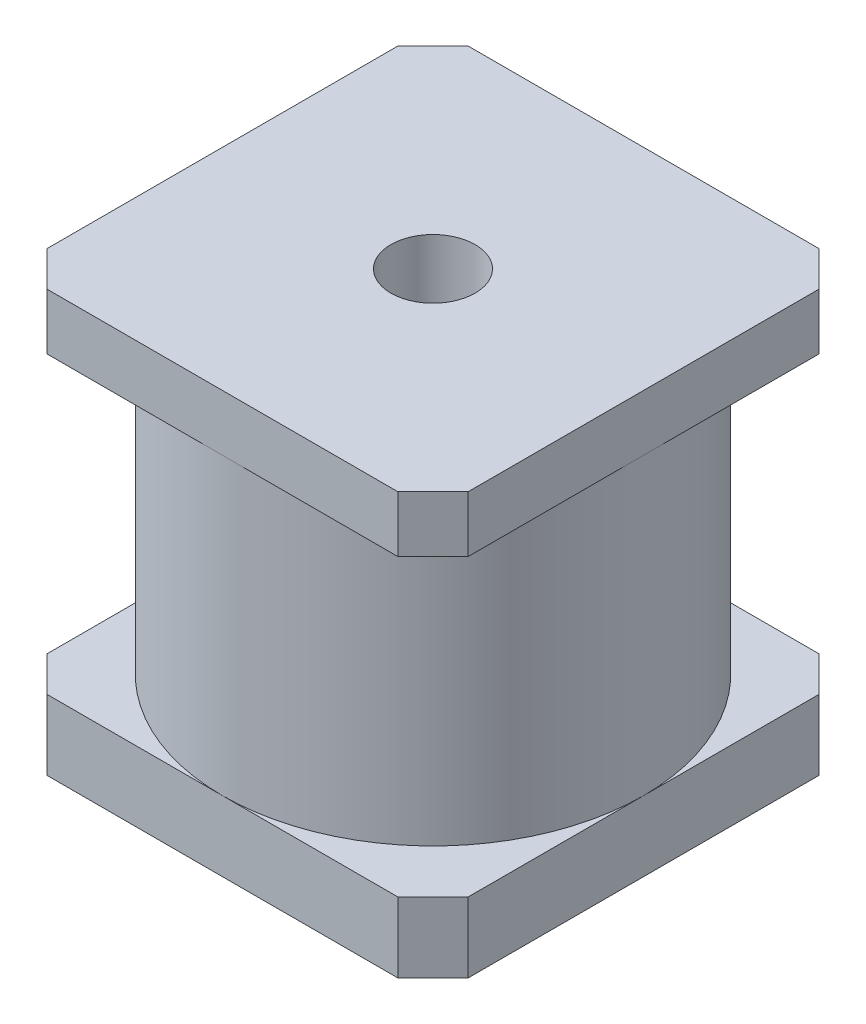
ISO-10303-21;
HEADER;
FILE_DESCRIPTION(('STEP AP214'),'2;1');
FILE_NAME('part.step','',(''),(''),'','','');
FILE_SCHEMA(('AUTOMOTIVE_DESIGN { 1 0 10303 214 1 1 1 1 }'));
ENDSEC;
DATA;
#1=APPLICATION_CONTEXT('core data for automotive mechanical design processes');
#2=APPLICATION_PROTOCOL_DEFINITION('international standard','automotive_design',2000,#1);
#3=PRODUCT_CONTEXT('',#1,'mechanical');
#4=PRODUCT('Part','Part','',(#3));
#5=PRODUCT_RELATED_PRODUCT_CATEGORY('part','',(#4));
#6=PRODUCT_DEFINITION_FORMATION('','',#4);
#7=PRODUCT_DEFINITION_CONTEXT('part definition',#1,'design');
#8=PRODUCT_DEFINITION('design','',#6,#7);
#9=PRODUCT_DEFINITION_SHAPE('','',#8);
#10=(LENGTH_UNIT() NAMED_UNIT(*) SI_UNIT(.MILLI.,.METRE.));
#11=(NAMED_UNIT(*) PLANE_ANGLE_UNIT() SI_UNIT($,.RADIAN.));
#12=(NAMED_UNIT(*) SI_UNIT($,.STERADIAN.) SOLID_ANGLE_UNIT());
#13=UNCERTAINTY_MEASURE_WITH_UNIT(LENGTH_MEASURE(1.E-05),#10,'distance_accuracy_value','');
#14=(GEOMETRIC_REPRESENTATION_CONTEXT(3) GLOBAL_UNCERTAINTY_ASSIGNED_CONTEXT((#13)) GLOBAL_UNIT_ASSIGNED_CONTEXT((#10,
#11,#12)) REPRESENTATION_CONTEXT('',''));
#15=CARTESIAN_POINT('',(0.,0.,0.));
#16=DIRECTION('',(0.,0.,1.));
#17=DIRECTION('',(1.,0.,0.));
#18=AXIS2_PLACEMENT_3D('',#15,#16,#17);
#19=CARTESIAN_POINT('',(0.,50.,0.));
#20=DIRECTION('',(0.,1.,0.));
#21=DIRECTION('',(1.,0.,0.));
#22=AXIS2_PLACEMENT_3D('',#19,#20,#21);
#23=PLANE('',#22);
#24=CARTESIAN_POINT('',(0.,50.,0.));
#25=DIRECTION('',(0.,1.,0.));
#26=DIRECTION('',(0.,0.,1.));
#27=AXIS2_PLACEMENT_3D('',#24,#25,#26);
#28=CIRCLE('',#27,6.);
#29=CARTESIAN_POINT('',(0.,50.,6.));
#30=VERTEX_POINT('',#29);
#31=EDGE_CURVE('E11',#30,#30,#28,.T.);
#32=ORIENTED_EDGE('',*,*,#31,.T.);
#33=EDGE_LOOP('',(#32));
#34=FACE_BOUND('',#33,.T.);
#35=ADVANCED_FACE('F17',(#34),#23,.T.);
#36=CARTESIAN_POINT('',(0.,50.,0.));
#37=DIRECTION('',(0.,1.,0.));
#38=DIRECTION('',(0.,0.,1.));
#39=AXIS2_PLACEMENT_3D('',#36,#37,#38);
#40=CYLINDRICAL_SURFACE('',#39,6.);
#41=ORIENTED_EDGE('',*,*,#31,.F.);
#42=EDGE_LOOP('',(#41));
#43=FACE_BOUND('',#42,.T.);
#44=CARTESIAN_POINT('',(0.,60.,0.));
#45=DIRECTION('',(0.,1.,0.));
#46=DIRECTION('',(0.,0.,1.));
#47=AXIS2_PLACEMENT_3D('',#44,#45,#46);
#48=CIRCLE('',#47,6.);
#49=CARTESIAN_POINT('',(0.,60.,6.));
#50=VERTEX_POINT('',#49);
#51=EDGE_CURVE('E360',#50,#50,#48,.T.);
#52=ORIENTED_EDGE('',*,*,#51,.T.);
#53=EDGE_LOOP('',(#52));
#54=FACE_BOUND('',#53,.T.);
#55=ADVANCED_FACE('F1212',(#43,#54),#40,.F.);
#56=CARTESIAN_POINT('',(30.,10.,25.));
#57=DIRECTION('',(-0.707106781186547,0.,-0.707106781186549));
#58=DIRECTION('',(-0.707106781186549,0.,0.707106781186547));
#59=AXIS2_PLACEMENT_3D('',#56,#57,#58);
#60=PLANE('',#59);
#61=DIRECTION('',(0.707106781186549,0.,-0.707106781186547));
#62=VECTOR('',#61,1.);
#63=CARTESIAN_POINT('',(30.,10.,25.));
#64=LINE('',#63,#62);
#65=CARTESIAN_POINT('',(25.,10.,30.));
#66=VERTEX_POINT('',#65);
#67=CARTESIAN_POINT('',(30.,10.,25.));
#68=VERTEX_POINT('',#67);
#69=EDGE_CURVE('E335',#66,#68,#64,.T.);
#70=ORIENTED_EDGE('',*,*,#69,.F.);
#71=DIRECTION('',(0.,1.,0.));
#72=VECTOR('',#71,1.);
#73=CARTESIAN_POINT('',(25.,10.,30.));
#74=LINE('',#73,#72);
#75=CARTESIAN_POINT('',(25.,0.,30.));
#76=VERTEX_POINT('',#75);
#77=EDGE_CURVE('E242',#76,#66,#74,.T.);
#78=ORIENTED_EDGE('',*,*,#77,.F.);
#79=DIRECTION('',(-0.707106781186549,0.,0.707106781186547));
#80=VECTOR('',#79,1.);
#81=CARTESIAN_POINT('',(30.,0.,25.));
#82=LINE('',#81,#80);
#83=CARTESIAN_POINT('',(30.,0.,25.));
#84=VERTEX_POINT('',#83);
#85=EDGE_CURVE('E169',#84,#76,#82,.T.);
#86=ORIENTED_EDGE('',*,*,#85,.F.);
#87=DIRECTION('',(0.,-1.,0.));
#88=VECTOR('',#87,1.);
#89=CARTESIAN_POINT('',(30.,10.,25.));
#90=LINE('',#89,#88);
#91=EDGE_CURVE('E178',#68,#84,#90,.T.);
#92=ORIENTED_EDGE('',*,*,#91,.F.);
#93=EDGE_LOOP('',(#70,#78,#86,#92));
#94=FACE_BOUND('',#93,.T.);
#95=ADVANCED_FACE('F425',(#94),#60,.F.);
#96=CARTESIAN_POINT('',(25.,10.,-30.));
#97=DIRECTION('',(-0.707106781186549,0.,0.707106781186547));
#98=DIRECTION('',(0.,1.,0.));
#99=AXIS2_PLACEMENT_3D('',#96,#97,#98);
#100=PLANE('',#99);
#101=DIRECTION('',(-0.707106781186547,0.,-0.707106781186549));
#102=VECTOR('',#101,1.);
#103=CARTESIAN_POINT('',(25.,10.,-30.));
#104=LINE('',#103,#102);
#105=CARTESIAN_POINT('',(30.,10.,-25.));
#106=VERTEX_POINT('',#105);
#107=CARTESIAN_POINT('',(25.,10.,-30.));
#108=VERTEX_POINT('',#107);
#109=EDGE_CURVE('E373',#106,#108,#104,.T.);
#110=ORIENTED_EDGE('',*,*,#109,.F.);
#111=DIRECTION('',(0.,1.,0.));
#112=VECTOR('',#111,1.);
#113=CARTESIAN_POINT('',(30.,10.,-25.));
#114=LINE('',#113,#112);
#115=CARTESIAN_POINT('',(30.,0.,-25.));
#116=VERTEX_POINT('',#115);
#117=EDGE_CURVE('E174',#116,#106,#114,.T.);
#118=ORIENTED_EDGE('',*,*,#117,.F.);
#119=DIRECTION('',(0.707106781186547,0.,0.707106781186549));
#120=VECTOR('',#119,1.);
#121=CARTESIAN_POINT('',(25.,0.,-30.));
#122=LINE('',#121,#120);
#123=CARTESIAN_POINT('',(25.,0.,-30.));
#124=VERTEX_POINT('',#123);
#125=EDGE_CURVE('E192',#124,#116,#122,.T.);
#126=ORIENTED_EDGE('',*,*,#125,.F.);
#127=DIRECTION('',(0.,-1.,0.));
#128=VECTOR('',#127,1.);
#129=CARTESIAN_POINT('',(25.,10.,-30.));
#130=LINE('',#129,#128);
#131=EDGE_CURVE('E179',#108,#124,#130,.T.);
#132=ORIENTED_EDGE('',*,*,#131,.F.);
#133=EDGE_LOOP('',(#110,#118,#126,#132));
#134=FACE_BOUND('',#133,.T.);
#135=ADVANCED_FACE('F449',(#134),#100,.F.);
#136=CARTESIAN_POINT('',(-30.,10.,-25.));
#137=DIRECTION('',(0.707106781186547,0.,0.707106781186549));
#138=DIRECTION('',(0.,-1.,0.));
#139=AXIS2_PLACEMENT_3D('',#136,#137,#138);
#140=PLANE('',#139);
#141=DIRECTION('',(-0.707106781186549,0.,0.707106781186547));
#142=VECTOR('',#141,1.);
#143=CARTESIAN_POINT('',(-30.,10.,-25.));
#144=LINE('',#143,#142);
#145=CARTESIAN_POINT('',(-25.,10.,-30.));
#146=VERTEX_POINT('',#145);
#147=CARTESIAN_POINT('',(-30.,10.,-25.));
#148=VERTEX_POINT('',#147);
#149=EDGE_CURVE('E183',#146,#148,#144,.T.);
#150=ORIENTED_EDGE('',*,*,#149,.F.);
#151=DIRECTION('',(0.,1.,0.));
#152=VECTOR('',#151,1.);
#153=CARTESIAN_POINT('',(-25.,10.,-30.));
#154=LINE('',#153,#152);
#155=CARTESIAN_POINT('',(-25.,0.,-30.));
#156=VERTEX_POINT('',#155);
#157=EDGE_CURVE('E250',#156,#146,#154,.T.);
#158=ORIENTED_EDGE('',*,*,#157,.F.);
#159=DIRECTION('',(0.707106781186549,0.,-0.707106781186547));
#160=VECTOR('',#159,1.);
#161=CARTESIAN_POINT('',(-30.,0.,-25.));
#162=LINE('',#161,#160);
#163=CARTESIAN_POINT('',(-30.,0.,-25.));
#164=VERTEX_POINT('',#163);
#165=EDGE_CURVE('E190',#164,#156,#162,.T.);
#166=ORIENTED_EDGE('',*,*,#165,.F.);
#167=DIRECTION('',(0.,-1.,0.));
#168=VECTOR('',#167,1.);
#169=CARTESIAN_POINT('',(-30.,10.,-25.));
#170=LINE('',#169,#168);
#171=EDGE_CURVE('E399',#148,#164,#170,.T.);
#172=ORIENTED_EDGE('',*,*,#171,.F.);
#173=EDGE_LOOP('',(#150,#158,#166,#172));
#174=FACE_BOUND('',#173,.T.);
#175=ADVANCED_FACE('F439',(#174),#140,.F.);
#176=CARTESIAN_POINT('',(-25.,10.,30.));
#177=DIRECTION('',(0.707106781186549,0.,-0.707106781186547));
#178=DIRECTION('',(0.,-1.,0.));
#179=AXIS2_PLACEMENT_3D('',#176,#177,#178);
#180=PLANE('',#179);
#181=DIRECTION('',(0.707106781186547,0.,0.707106781186549));
#182=VECTOR('',#181,1.);
#183=CARTESIAN_POINT('',(-25.,10.,30.));
#184=LINE('',#183,#182);
#185=CARTESIAN_POINT('',(-30.,10.,25.));
#186=VERTEX_POINT('',#185);
#187=CARTESIAN_POINT('',(-25.,10.,30.));
#188=VERTEX_POINT('',#187);
#189=EDGE_CURVE('E275',#186,#188,#184,.T.);
#190=ORIENTED_EDGE('',*,*,#189,.F.);
#191=DIRECTION('',(0.,1.,0.));
#192=VECTOR('',#191,1.);
#193=CARTESIAN_POINT('',(-30.,10.,25.));
#194=LINE('',#193,#192);
#195=CARTESIAN_POINT('',(-30.,0.,25.));
#196=VERTEX_POINT('',#195);
#197=EDGE_CURVE('E211',#196,#186,#194,.T.);
#198=ORIENTED_EDGE('',*,*,#197,.F.);
#199=DIRECTION('',(-0.707106781186547,0.,-0.707106781186549));
#200=VECTOR('',#199,1.);
#201=CARTESIAN_POINT('',(-25.,0.,30.));
#202=LINE('',#201,#200);
#203=CARTESIAN_POINT('',(-25.,0.,30.));
#204=VERTEX_POINT('',#203);
#205=EDGE_CURVE('E187',#204,#196,#202,.T.);
#206=ORIENTED_EDGE('',*,*,#205,.F.);
#207=DIRECTION('',(0.,-1.,0.));
#208=VECTOR('',#207,1.);
#209=CARTESIAN_POINT('',(-25.,10.,30.));
#210=LINE('',#209,#208);
#211=EDGE_CURVE('E243',#188,#204,#210,.T.);
#212=ORIENTED_EDGE('',*,*,#211,.F.);
#213=EDGE_LOOP('',(#190,#198,#206,#212));
#214=FACE_BOUND('',#213,.T.);
#215=ADVANCED_FACE('F432',(#214),#180,.F.);
#216=CARTESIAN_POINT('',(25.,52.,30.));
#217=DIRECTION('',(-0.707106781186549,0.,-0.707106781186547));
#218=DIRECTION('',(-0.707106781186547,0.,0.707106781186549));
#219=AXIS2_PLACEMENT_3D('',#216,#217,#218);
#220=PLANE('',#219);
#221=DIRECTION('',(-0.707106781186547,0.,0.707106781186549));
#222=VECTOR('',#221,1.);
#223=CARTESIAN_POINT('',(25.,52.,30.));
#224=LINE('',#223,#222);
#225=CARTESIAN_POINT('',(30.,52.,25.));
#226=VERTEX_POINT('',#225);
#227=CARTESIAN_POINT('',(25.,52.,30.));
#228=VERTEX_POINT('',#227);
#229=EDGE_CURVE('E260',#226,#228,#224,.T.);
#230=ORIENTED_EDGE('',*,*,#229,.F.);
#231=DIRECTION('',(0.,-1.,0.));
#232=VECTOR('',#231,1.);
#233=CARTESIAN_POINT('',(30.,52.,25.));
#234=LINE('',#233,#232);
#235=CARTESIAN_POINT('',(30.,60.,25.));
#236=VERTEX_POINT('',#235);
#237=EDGE_CURVE('E339',#236,#226,#234,.T.);
#238=ORIENTED_EDGE('',*,*,#237,.F.);
#239=DIRECTION('',(0.707106781186547,0.,-0.707106781186549));
#240=VECTOR('',#239,1.);
#241=CARTESIAN_POINT('',(27.5,60.,27.5));
#242=LINE('',#241,#240);
#243=CARTESIAN_POINT('',(25.,60.,30.));
#244=VERTEX_POINT('',#243);
#245=EDGE_CURVE('E232',#244,#236,#242,.T.);
#246=ORIENTED_EDGE('',*,*,#245,.F.);
#247=DIRECTION('',(0.,1.,0.));
#248=VECTOR('',#247,1.);
#249=CARTESIAN_POINT('',(25.,52.,30.));
#250=LINE('',#249,#248);
#251=EDGE_CURVE('E284',#228,#244,#250,.T.);
#252=ORIENTED_EDGE('',*,*,#251,.F.);
#253=EDGE_LOOP('',(#230,#238,#246,#252));
#254=FACE_BOUND('',#253,.T.);
#255=ADVANCED_FACE('F556',(#254),#220,.F.);
#256=CARTESIAN_POINT('',(30.,52.,-25.));
#257=DIRECTION('',(-0.707106781186547,0.,0.707106781186549));
#258=DIRECTION('',(0.,1.,0.));
#259=AXIS2_PLACEMENT_3D('',#256,#257,#258);
#260=PLANE('',#259);
#261=DIRECTION('',(0.707106781186549,0.,0.707106781186547));
#262=VECTOR('',#261,1.);
#263=CARTESIAN_POINT('',(30.,52.,-25.));
#264=LINE('',#263,#262);
#265=CARTESIAN_POINT('',(25.,52.,-30.));
#266=VERTEX_POINT('',#265);
#267=CARTESIAN_POINT('',(30.,52.,-25.));
#268=VERTEX_POINT('',#267);
#269=EDGE_CURVE('E261',#266,#268,#264,.T.);
#270=ORIENTED_EDGE('',*,*,#269,.F.);
#271=DIRECTION('',(0.,-1.,0.));
#272=VECTOR('',#271,1.);
#273=CARTESIAN_POINT('',(25.,52.,-30.));
#274=LINE('',#273,#272);
#275=CARTESIAN_POINT('',(25.,60.,-30.));
#276=VERTEX_POINT('',#275);
#277=EDGE_CURVE('E322',#276,#266,#274,.T.);
#278=ORIENTED_EDGE('',*,*,#277,.F.);
#279=DIRECTION('',(-0.707106781186549,0.,-0.707106781186547));
#280=VECTOR('',#279,1.);
#281=CARTESIAN_POINT('',(27.5,60.,-27.5));
#282=LINE('',#281,#280);
#283=CARTESIAN_POINT('',(30.,60.,-25.));
#284=VERTEX_POINT('',#283);
#285=EDGE_CURVE('E228',#284,#276,#282,.T.);
#286=ORIENTED_EDGE('',*,*,#285,.F.);
#287=DIRECTION('',(0.,1.,0.));
#288=VECTOR('',#287,1.);
#289=CARTESIAN_POINT('',(30.,52.,-25.));
#290=LINE('',#289,#288);
#291=EDGE_CURVE('E326',#268,#284,#290,.T.);
#292=ORIENTED_EDGE('',*,*,#291,.F.);
#293=EDGE_LOOP('',(#270,#278,#286,#292));
#294=FACE_BOUND('',#293,.T.);
#295=ADVANCED_FACE('F559',(#294),#260,.F.);
#296=CARTESIAN_POINT('',(-25.,52.,-30.));
#297=DIRECTION('',(0.707106781186549,0.,0.707106781186547));
#298=DIRECTION('',(0.,-1.,0.));
#299=AXIS2_PLACEMENT_3D('',#296,#297,#298);
#300=PLANE('',#299);
#301=DIRECTION('',(0.707106781186547,0.,-0.707106781186549));
#302=VECTOR('',#301,1.);
#303=CARTESIAN_POINT('',(-25.,52.,-30.));
#304=LINE('',#303,#302);
#305=CARTESIAN_POINT('',(-30.,52.,-25.));
#306=VERTEX_POINT('',#305);
#307=CARTESIAN_POINT('',(-25.,52.,-30.));
#308=VERTEX_POINT('',#307);
#309=EDGE_CURVE('E216',#306,#308,#304,.T.);
#310=ORIENTED_EDGE('',*,*,#309,.F.);
#311=DIRECTION('',(0.,-1.,0.));
#312=VECTOR('',#311,1.);
#313=CARTESIAN_POINT('',(-30.,52.,-25.));
#314=LINE('',#313,#312);
#315=CARTESIAN_POINT('',(-30.,60.,-25.));
#316=VERTEX_POINT('',#315);
#317=EDGE_CURVE('E310',#316,#306,#314,.T.);
#318=ORIENTED_EDGE('',*,*,#317,.F.);
#319=DIRECTION('',(-0.707106781186547,0.,0.707106781186549));
#320=VECTOR('',#319,1.);
#321=CARTESIAN_POINT('',(-27.5,60.,-27.5));
#322=LINE('',#321,#320);
#323=CARTESIAN_POINT('',(-25.,60.,-30.));
#324=VERTEX_POINT('',#323);
#325=EDGE_CURVE('E231',#324,#316,#322,.T.);
#326=ORIENTED_EDGE('',*,*,#325,.F.);
#327=DIRECTION('',(0.,1.,0.));
#328=VECTOR('',#327,1.);
#329=CARTESIAN_POINT('',(-25.,52.,-30.));
#330=LINE('',#329,#328);
#331=EDGE_CURVE('E314',#308,#324,#330,.T.);
#332=ORIENTED_EDGE('',*,*,#331,.F.);
#333=EDGE_LOOP('',(#310,#318,#326,#332));
#334=FACE_BOUND('',#333,.T.);
#335=ADVANCED_FACE('F537',(#334),#300,.F.);
#336=CARTESIAN_POINT('',(-30.,52.,25.));
#337=DIRECTION('',(0.707106781186547,0.,-0.707106781186549));
#338=DIRECTION('',(0.,-1.,0.));
#339=AXIS2_PLACEMENT_3D('',#336,#337,#338);
#340=PLANE('',#339);
#341=DIRECTION('',(-0.707106781186549,0.,-0.707106781186547));
#342=VECTOR('',#341,1.);
#343=CARTESIAN_POINT('',(-30.,52.,25.));
#344=LINE('',#343,#342);
#345=CARTESIAN_POINT('',(-25.,52.,30.));
#346=VERTEX_POINT('',#345);
#347=CARTESIAN_POINT('',(-30.,52.,25.));
#348=VERTEX_POINT('',#347);
#349=EDGE_CURVE('E288',#346,#348,#344,.T.);
#350=ORIENTED_EDGE('',*,*,#349,.F.);
#351=DIRECTION('',(0.,-1.,0.));
#352=VECTOR('',#351,1.);
#353=CARTESIAN_POINT('',(-25.,52.,30.));
#354=LINE('',#353,#352);
#355=CARTESIAN_POINT('',(-25.,60.,30.));
#356=VERTEX_POINT('',#355);
#357=EDGE_CURVE('E347',#356,#346,#354,.T.);
#358=ORIENTED_EDGE('',*,*,#357,.F.);
#359=DIRECTION('',(0.707106781186549,0.,0.707106781186547));
#360=VECTOR('',#359,1.);
#361=CARTESIAN_POINT('',(-27.5,60.,27.5));
#362=LINE('',#361,#360);
#363=CARTESIAN_POINT('',(-30.,60.,25.));
#364=VERTEX_POINT('',#363);
#365=EDGE_CURVE('E313',#364,#356,#362,.T.);
#366=ORIENTED_EDGE('',*,*,#365,.F.);
#367=DIRECTION('',(0.,1.,0.));
#368=VECTOR('',#367,1.);
#369=CARTESIAN_POINT('',(-30.,52.,25.));
#370=LINE('',#369,#368);
#371=EDGE_CURVE('E302',#348,#364,#370,.T.);
#372=ORIENTED_EDGE('',*,*,#371,.F.);
#373=EDGE_LOOP('',(#350,#358,#366,#372));
#374=FACE_BOUND('',#373,.T.);
#375=ADVANCED_FACE('F545',(#374),#340,.F.);
#376=CARTESIAN_POINT('',(0.,15.,0.));
#377=DIRECTION('',(0.,-1.,0.));
#378=DIRECTION('',(0.,0.,-1.));
#379=AXIS2_PLACEMENT_3D('',#376,#377,#378);
#380=PLANE('',#379);
#381=CARTESIAN_POINT('',(0.,15.,0.));
#382=DIRECTION('',(0.,-1.,0.));
#383=DIRECTION('',(0.,0.,-1.));
#384=AXIS2_PLACEMENT_3D('',#381,#382,#383);
#385=CIRCLE('',#384,7.);
#386=CARTESIAN_POINT('',(0.,15.,-7.));
#387=VERTEX_POINT('',#386);
#388=EDGE_CURVE('E27',#387,#387,#385,.T.);
#389=ORIENTED_EDGE('',*,*,#388,.T.);
#390=EDGE_LOOP('',(#389));
#391=FACE_BOUND('',#390,.T.);
#392=ADVANCED_FACE('F1128',(#391),#380,.T.);
#393=CARTESIAN_POINT('',(0.,-5.000012,0.));
#394=DIRECTION('',(0.,1.,0.));
#395=DIRECTION('',(0.,0.,1.));
#396=AXIS2_PLACEMENT_3D('',#393,#394,#395);
#397=CYLINDRICAL_SURFACE('',#396,7.);
#398=CARTESIAN_POINT('',(0.,-5.,0.));
#399=DIRECTION('',(0.,1.,0.));
#400=DIRECTION('',(0.,0.,-1.));
#401=AXIS2_PLACEMENT_3D('',#398,#399,#400);
#402=CIRCLE('',#401,7.);
#403=CARTESIAN_POINT('',(0.,-5.,-7.));
#404=VERTEX_POINT('',#403);
#405=EDGE_CURVE('E20',#404,#404,#402,.T.);
#406=ORIENTED_EDGE('',*,*,#405,.F.);
#407=EDGE_LOOP('',(#406));
#408=FACE_BOUND('',#407,.T.);
#409=ORIENTED_EDGE('',*,*,#388,.F.);
#410=EDGE_LOOP('',(#409));
#411=FACE_BOUND('',#410,.T.);
#412=ADVANCED_FACE('F1117',(#408,#411),#397,.F.);
#413=CARTESIAN_POINT('',(0.,-5.,0.));
#414=DIRECTION('',(0.,-1.,0.));
#415=DIRECTION('',(0.,0.,-1.));
#416=AXIS2_PLACEMENT_3D('',#413,#414,#415);
#417=PLANE('',#416);
#418=ORIENTED_EDGE('',*,*,#405,.T.);
#419=EDGE_LOOP('',(#418));
#420=FACE_BOUND('',#419,.T.);
#421=CARTESIAN_POINT('',(0.,-5.,0.));
#422=DIRECTION('',(0.,-1.,0.));
#423=DIRECTION('',(0.,0.,-1.));
#424=AXIS2_PLACEMENT_3D('',#421,#422,#423);
#425=CIRCLE('',#424,17.5);
#426=CARTESIAN_POINT('',(0.,-5.,-17.5));
#427=VERTEX_POINT('',#426);
#428=EDGE_CURVE('E158',#427,#427,#425,.T.);
#429=ORIENTED_EDGE('',*,*,#428,.T.);
#430=EDGE_LOOP('',(#429));
#431=FACE_BOUND('',#430,.T.);
#432=ADVANCED_FACE('F159',(#420,#431),#417,.T.);
#433=CARTESIAN_POINT('',(0.,-5.,0.));
#434=DIRECTION('',(0.,1.,0.));
#435=DIRECTION('',(0.,0.,1.));
#436=AXIS2_PLACEMENT_3D('',#433,#434,#435);
#437=CYLINDRICAL_SURFACE('',#436,17.5);
#438=ORIENTED_EDGE('',*,*,#428,.F.);
#439=EDGE_LOOP('',(#438));
#440=FACE_BOUND('',#439,.T.);
#441=CARTESIAN_POINT('',(0.,0.,0.));
#442=DIRECTION('',(0.,-1.,0.));
#443=DIRECTION('',(0.,0.,-1.));
#444=AXIS2_PLACEMENT_3D('',#441,#442,#443);
#445=CIRCLE('',#444,17.5);
#446=CARTESIAN_POINT('',(0.,0.,-17.5));
#447=VERTEX_POINT('',#446);
#448=EDGE_CURVE('E162',#447,#447,#445,.T.);
#449=ORIENTED_EDGE('',*,*,#448,.T.);
#450=EDGE_LOOP('',(#449));
#451=FACE_BOUND('',#450,.T.);
#452=ADVANCED_FACE('F1097',(#440,#451),#437,.T.);
#453=CARTESIAN_POINT('',(0.,0.,0.));
#454=DIRECTION('',(0.,1.,0.));
#455=DIRECTION('',(1.,0.,0.));
#456=AXIS2_PLACEMENT_3D('',#453,#454,#455);
#457=PLANE('',#456);
#458=ORIENTED_EDGE('',*,*,#448,.F.);
#459=EDGE_LOOP('',(#458));
#460=FACE_BOUND('',#459,.T.);
#461=DIRECTION('',(-1.,0.,0.));
#462=VECTOR('',#461,1.);
#463=CARTESIAN_POINT('',(30.,0.,30.));
#464=LINE('',#463,#462);
#465=EDGE_CURVE('E238',#76,#204,#464,.T.);
#466=ORIENTED_EDGE('',*,*,#465,.T.);
#467=ORIENTED_EDGE('',*,*,#205,.T.);
#468=DIRECTION('',(0.,0.,-1.));
#469=VECTOR('',#468,1.);
#470=CARTESIAN_POINT('',(-30.,0.,-30.));
#471=LINE('',#470,#469);
#472=EDGE_CURVE('E215',#196,#164,#471,.T.);
#473=ORIENTED_EDGE('',*,*,#472,.T.);
#474=ORIENTED_EDGE('',*,*,#165,.T.);
#475=DIRECTION('',(1.,0.,0.));
#476=VECTOR('',#475,1.);
#477=CARTESIAN_POINT('',(30.,0.,-30.));
#478=LINE('',#477,#476);
#479=EDGE_CURVE('E369',#156,#124,#478,.T.);
#480=ORIENTED_EDGE('',*,*,#479,.T.);
#481=ORIENTED_EDGE('',*,*,#125,.T.);
#482=DIRECTION('',(0.,0.,1.));
#483=VECTOR('',#482,1.);
#484=CARTESIAN_POINT('',(30.,0.,-30.));
#485=LINE('',#484,#483);
#486=EDGE_CURVE('E172',#116,#84,#485,.T.);
#487=ORIENTED_EDGE('',*,*,#486,.T.);
#488=ORIENTED_EDGE('',*,*,#85,.T.);
#489=EDGE_LOOP('',(#466,#467,#473,#474,#480,#481,#487,#488));
#490=FACE_BOUND('',#489,.T.);
#491=ADVANCED_FACE('F419',(#460,#490),#457,.F.);
#492=CARTESIAN_POINT('',(0.,10.,0.));
#493=DIRECTION('',(0.,-1.,0.));
#494=DIRECTION('',(0.,0.,-1.));
#495=AXIS2_PLACEMENT_3D('',#492,#493,#494);
#496=PLANE('',#495);
#497=DIRECTION('',(1.,0.,0.));
#498=VECTOR('',#497,1.);
#499=CARTESIAN_POINT('',(30.,10.,-30.));
#500=LINE('',#499,#498);
#501=CARTESIAN_POINT('',(0.,10.,-30.));
#502=VERTEX_POINT('',#501);
#503=EDGE_CURVE('E184',#146,#502,#500,.T.);
#504=ORIENTED_EDGE('',*,*,#503,.F.);
#505=ORIENTED_EDGE('',*,*,#149,.T.);
#506=DIRECTION('',(0.,0.,-1.));
#507=VECTOR('',#506,1.);
#508=CARTESIAN_POINT('',(-30.,10.,-30.));
#509=LINE('',#508,#507);
#510=CARTESIAN_POINT('',(-30.,10.,0.));
#511=VERTEX_POINT('',#510);
#512=EDGE_CURVE('E214',#511,#148,#509,.T.);
#513=ORIENTED_EDGE('',*,*,#512,.F.);
#514=CARTESIAN_POINT('',(0.,10.,0.));
#515=DIRECTION('',(0.,-1.,0.));
#516=DIRECTION('',(0.,0.,-1.));
#517=AXIS2_PLACEMENT_3D('',#514,#515,#516);
#518=CIRCLE('',#517,30.);
#519=EDGE_CURVE('E574',#511,#502,#518,.T.);
#520=ORIENTED_EDGE('',*,*,#519,.T.);
#521=EDGE_LOOP('',(#504,#505,#513,#520));
#522=FACE_BOUND('',#521,.T.);
#523=ADVANCED_FACE('F1078',(#522),#496,.F.);
#524=CARTESIAN_POINT('',(30.,10.,-30.));
#525=DIRECTION('',(0.,0.,-1.));
#526=DIRECTION('',(0.,-1.,0.));
#527=AXIS2_PLACEMENT_3D('',#524,#525,#526);
#528=PLANE('',#527);
#529=ORIENTED_EDGE('',*,*,#479,.F.);
#530=ORIENTED_EDGE('',*,*,#157,.T.);
#531=ORIENTED_EDGE('',*,*,#503,.T.);
#532=DIRECTION('',(1.,0.,0.));
#533=VECTOR('',#532,1.);
#534=CARTESIAN_POINT('',(30.,10.,-30.));
#535=LINE('',#534,#533);
#536=EDGE_CURVE('E377',#502,#108,#535,.T.);
#537=ORIENTED_EDGE('',*,*,#536,.T.);
#538=ORIENTED_EDGE('',*,*,#131,.T.);
#539=EDGE_LOOP('',(#529,#530,#531,#537,#538));
#540=FACE_BOUND('',#539,.T.);
#541=ADVANCED_FACE('F446',(#540),#528,.T.);
#542=CARTESIAN_POINT('',(30.,10.,-30.));
#543=DIRECTION('',(1.,0.,0.));
#544=DIRECTION('',(0.,1.,0.));
#545=AXIS2_PLACEMENT_3D('',#542,#543,#544);
#546=PLANE('',#545);
#547=ORIENTED_EDGE('',*,*,#486,.F.);
#548=ORIENTED_EDGE('',*,*,#117,.T.);
#549=DIRECTION('',(0.,0.,1.));
#550=VECTOR('',#549,1.);
#551=CARTESIAN_POINT('',(30.,10.,-30.));
#552=LINE('',#551,#550);
#553=CARTESIAN_POINT('',(30.,10.,0.));
#554=VERTEX_POINT('',#553);
#555=EDGE_CURVE('E365',#106,#554,#552,.T.);
#556=ORIENTED_EDGE('',*,*,#555,.T.);
#557=DIRECTION('',(0.,0.,1.));
#558=VECTOR('',#557,1.);
#559=CARTESIAN_POINT('',(30.,10.,-30.));
#560=LINE('',#559,#558);
#561=EDGE_CURVE('E331',#554,#68,#560,.T.);
#562=ORIENTED_EDGE('',*,*,#561,.T.);
#563=ORIENTED_EDGE('',*,*,#91,.T.);
#564=EDGE_LOOP('',(#547,#548,#556,#562,#563));
#565=FACE_BOUND('',#564,.T.);
#566=ADVANCED_FACE('F421',(#565),#546,.T.);
#567=CARTESIAN_POINT('',(30.,10.,30.));
#568=DIRECTION('',(0.,0.,1.));
#569=DIRECTION('',(1.,0.,0.));
#570=AXIS2_PLACEMENT_3D('',#567,#568,#569);
#571=PLANE('',#570);
#572=DIRECTION('',(-1.,0.,0.));
#573=VECTOR('',#572,1.);
#574=CARTESIAN_POINT('',(30.,10.,30.));
#575=LINE('',#574,#573);
#576=CARTESIAN_POINT('',(0.,10.,30.));
#577=VERTEX_POINT('',#576);
#578=EDGE_CURVE('E279',#577,#188,#575,.T.);
#579=ORIENTED_EDGE('',*,*,#578,.T.);
#580=ORIENTED_EDGE('',*,*,#211,.T.);
#581=ORIENTED_EDGE('',*,*,#465,.F.);
#582=ORIENTED_EDGE('',*,*,#77,.T.);
#583=DIRECTION('',(-1.,0.,0.));
#584=VECTOR('',#583,1.);
#585=CARTESIAN_POINT('',(30.,10.,30.));
#586=LINE('',#585,#584);
#587=EDGE_CURVE('E381',#66,#577,#586,.T.);
#588=ORIENTED_EDGE('',*,*,#587,.T.);
#589=EDGE_LOOP('',(#579,#580,#581,#582,#588));
#590=FACE_BOUND('',#589,.T.);
#591=ADVANCED_FACE('F427',(#590),#571,.T.);
#592=CARTESIAN_POINT('',(-30.,10.,-30.));
#593=DIRECTION('',(-1.,0.,0.));
#594=DIRECTION('',(0.,0.,1.));
#595=AXIS2_PLACEMENT_3D('',#592,#593,#594);
#596=PLANE('',#595);
#597=ORIENTED_EDGE('',*,*,#472,.F.);
#598=ORIENTED_EDGE('',*,*,#197,.T.);
#599=DIRECTION('',(0.,0.,-1.));
#600=VECTOR('',#599,1.);
#601=CARTESIAN_POINT('',(-30.,10.,-30.));
#602=LINE('',#601,#600);
#603=EDGE_CURVE('E280',#186,#511,#602,.T.);
#604=ORIENTED_EDGE('',*,*,#603,.T.);
#605=ORIENTED_EDGE('',*,*,#512,.T.);
#606=ORIENTED_EDGE('',*,*,#171,.T.);
#607=EDGE_LOOP('',(#597,#598,#604,#605,#606));
#608=FACE_BOUND('',#607,.T.);
#609=ADVANCED_FACE('F435',(#608),#596,.T.);
#610=CARTESIAN_POINT('',(0.,10.,0.));
#611=DIRECTION('',(0.,-1.,0.));
#612=DIRECTION('',(0.,0.,-1.));
#613=AXIS2_PLACEMENT_3D('',#610,#611,#612);
#614=PLANE('',#613);
#615=ORIENTED_EDGE('',*,*,#603,.F.);
#616=ORIENTED_EDGE('',*,*,#189,.T.);
#617=ORIENTED_EDGE('',*,*,#578,.F.);
#618=CARTESIAN_POINT('',(0.,10.,0.));
#619=DIRECTION('',(0.,-1.,0.));
#620=DIRECTION('',(0.,0.,-1.));
#621=AXIS2_PLACEMENT_3D('',#618,#619,#620);
#622=CIRCLE('',#621,30.);
#623=EDGE_CURVE('E209',#577,#511,#622,.T.);
#624=ORIENTED_EDGE('',*,*,#623,.T.);
#625=EDGE_LOOP('',(#615,#616,#617,#624));
#626=FACE_BOUND('',#625,.T.);
#627=ADVANCED_FACE('F930',(#626),#614,.F.);
#628=CARTESIAN_POINT('',(0.,10.,0.));
#629=DIRECTION('',(0.,-1.,0.));
#630=DIRECTION('',(0.,0.,-1.));
#631=AXIS2_PLACEMENT_3D('',#628,#629,#630);
#632=PLANE('',#631);
#633=ORIENTED_EDGE('',*,*,#587,.F.);
#634=ORIENTED_EDGE('',*,*,#69,.T.);
#635=ORIENTED_EDGE('',*,*,#561,.F.);
#636=CARTESIAN_POINT('',(0.,10.,0.));
#637=DIRECTION('',(0.,-1.,0.));
#638=DIRECTION('',(0.,0.,-1.));
#639=AXIS2_PLACEMENT_3D('',#636,#637,#638);
#640=CIRCLE('',#639,30.);
#641=EDGE_CURVE('E233',#554,#577,#640,.T.);
#642=ORIENTED_EDGE('',*,*,#641,.T.);
#643=EDGE_LOOP('',(#633,#634,#635,#642));
#644=FACE_BOUND('',#643,.T.);
#645=ADVANCED_FACE('F471',(#644),#632,.F.);
#646=CARTESIAN_POINT('',(0.,10.,0.));
#647=DIRECTION('',(0.,-1.,0.));
#648=DIRECTION('',(0.,0.,-1.));
#649=AXIS2_PLACEMENT_3D('',#646,#647,#648);
#650=PLANE('',#649);
#651=ORIENTED_EDGE('',*,*,#555,.F.);
#652=ORIENTED_EDGE('',*,*,#109,.T.);
#653=ORIENTED_EDGE('',*,*,#536,.F.);
#654=CARTESIAN_POINT('',(0.,10.,0.));
#655=DIRECTION('',(0.,-1.,0.));
#656=DIRECTION('',(0.,0.,-1.));
#657=AXIS2_PLACEMENT_3D('',#654,#655,#656);
#658=CIRCLE('',#657,30.);
#659=EDGE_CURVE('E458',#502,#554,#658,.T.);
#660=ORIENTED_EDGE('',*,*,#659,.T.);
#661=EDGE_LOOP('',(#651,#652,#653,#660));
#662=FACE_BOUND('',#661,.T.);
#663=ADVANCED_FACE('F455',(#662),#650,.F.);
#664=CARTESIAN_POINT('',(0.,60.,0.));
#665=DIRECTION('',(0.,1.,0.));
#666=DIRECTION('',(1.,0.,0.));
#667=AXIS2_PLACEMENT_3D('',#664,#665,#666);
#668=PLANE('',#667);
#669=ORIENTED_EDGE('',*,*,#51,.F.);
#670=EDGE_LOOP('',(#669));
#671=FACE_BOUND('',#670,.T.);
#672=DIRECTION('',(0.,0.,1.));
#673=VECTOR('',#672,1.);
#674=CARTESIAN_POINT('',(-30.,60.,30.));
#675=LINE('',#674,#673);
#676=EDGE_CURVE('E306',#316,#364,#675,.T.);
#677=ORIENTED_EDGE('',*,*,#676,.T.);
#678=ORIENTED_EDGE('',*,*,#365,.T.);
#679=DIRECTION('',(1.,0.,0.));
#680=VECTOR('',#679,1.);
#681=CARTESIAN_POINT('',(30.,60.,30.));
#682=LINE('',#681,#680);
#683=EDGE_CURVE('E343',#356,#244,#682,.T.);
#684=ORIENTED_EDGE('',*,*,#683,.T.);
#685=ORIENTED_EDGE('',*,*,#245,.T.);
#686=DIRECTION('',(0.,0.,-1.));
#687=VECTOR('',#686,1.);
#688=CARTESIAN_POINT('',(30.,60.,30.));
#689=LINE('',#688,#687);
#690=EDGE_CURVE('E330',#236,#284,#689,.T.);
#691=ORIENTED_EDGE('',*,*,#690,.T.);
#692=ORIENTED_EDGE('',*,*,#285,.T.);
#693=DIRECTION('',(-1.,0.,0.));
#694=VECTOR('',#693,1.);
#695=CARTESIAN_POINT('',(30.,60.,-30.));
#696=LINE('',#695,#694);
#697=EDGE_CURVE('E318',#276,#324,#696,.T.);
#698=ORIENTED_EDGE('',*,*,#697,.T.);
#699=ORIENTED_EDGE('',*,*,#325,.T.);
#700=EDGE_LOOP('',(#677,#678,#684,#685,#691,#692,#698,#699));
#701=FACE_BOUND('',#700,.T.);
#702=ADVANCED_FACE('F533',(#671,#701),#668,.T.);
#703=CARTESIAN_POINT('',(0.,52.,0.));
#704=DIRECTION('',(0.,1.,0.));
#705=DIRECTION('',(1.,0.,0.));
#706=AXIS2_PLACEMENT_3D('',#703,#704,#705);
#707=PLANE('',#706);
#708=DIRECTION('',(1.,0.,0.));
#709=VECTOR('',#708,1.);
#710=CARTESIAN_POINT('',(30.,52.,30.));
#711=LINE('',#710,#709);
#712=CARTESIAN_POINT('',(0.,52.,30.));
#713=VERTEX_POINT('',#712);
#714=EDGE_CURVE('E289',#346,#713,#711,.T.);
#715=ORIENTED_EDGE('',*,*,#714,.F.);
#716=ORIENTED_EDGE('',*,*,#349,.T.);
#717=DIRECTION('',(0.,0.,1.));
#718=VECTOR('',#717,1.);
#719=CARTESIAN_POINT('',(-30.,52.,30.));
#720=LINE('',#719,#718);
#721=CARTESIAN_POINT('',(-30.,52.,0.));
#722=VERTEX_POINT('',#721);
#723=EDGE_CURVE('E298',#722,#348,#720,.T.);
#724=ORIENTED_EDGE('',*,*,#723,.F.);
#725=CARTESIAN_POINT('',(0.,52.,0.));
#726=DIRECTION('',(0.,1.,0.));
#727=DIRECTION('',(0.,0.,1.));
#728=AXIS2_PLACEMENT_3D('',#725,#726,#727);
#729=CIRCLE('',#728,30.);
#730=EDGE_CURVE('E227',#722,#713,#729,.T.);
#731=ORIENTED_EDGE('',*,*,#730,.T.);
#732=EDGE_LOOP('',(#715,#716,#724,#731));
#733=FACE_BOUND('',#732,.T.);
#734=ADVANCED_FACE('F1017',(#733),#707,.F.);
#735=CARTESIAN_POINT('',(30.,52.,30.));
#736=DIRECTION('',(0.,0.,1.));
#737=DIRECTION('',(1.,0.,0.));
#738=AXIS2_PLACEMENT_3D('',#735,#736,#737);
#739=PLANE('',#738);
#740=ORIENTED_EDGE('',*,*,#683,.F.);
#741=ORIENTED_EDGE('',*,*,#357,.T.);
#742=ORIENTED_EDGE('',*,*,#714,.T.);
#743=DIRECTION('',(1.,0.,0.));
#744=VECTOR('',#743,1.);
#745=CARTESIAN_POINT('',(30.,52.,30.));
#746=LINE('',#745,#744);
#747=EDGE_CURVE('E255',#713,#228,#746,.T.);
#748=ORIENTED_EDGE('',*,*,#747,.T.);
#749=ORIENTED_EDGE('',*,*,#251,.T.);
#750=EDGE_LOOP('',(#740,#741,#742,#748,#749));
#751=FACE_BOUND('',#750,.T.);
#752=ADVANCED_FACE('F550',(#751),#739,.T.);
#753=CARTESIAN_POINT('',(30.,52.,30.));
#754=DIRECTION('',(1.,0.,0.));
#755=DIRECTION('',(0.,1.,0.));
#756=AXIS2_PLACEMENT_3D('',#753,#754,#755);
#757=PLANE('',#756);
#758=DIRECTION('',(0.,0.,-1.));
#759=VECTOR('',#758,1.);
#760=CARTESIAN_POINT('',(30.,52.,30.));
#761=LINE('',#760,#759);
#762=CARTESIAN_POINT('',(30.,52.,0.));
#763=VERTEX_POINT('',#762);
#764=EDGE_CURVE('E265',#763,#268,#761,.T.);
#765=ORIENTED_EDGE('',*,*,#764,.T.);
#766=ORIENTED_EDGE('',*,*,#291,.T.);
#767=ORIENTED_EDGE('',*,*,#690,.F.);
#768=ORIENTED_EDGE('',*,*,#237,.T.);
#769=DIRECTION('',(0.,0.,-1.));
#770=VECTOR('',#769,1.);
#771=CARTESIAN_POINT('',(30.,52.,30.));
#772=LINE('',#771,#770);
#773=EDGE_CURVE('E254',#226,#763,#772,.T.);
#774=ORIENTED_EDGE('',*,*,#773,.T.);
#775=EDGE_LOOP('',(#765,#766,#767,#768,#774));
#776=FACE_BOUND('',#775,.T.);
#777=ADVANCED_FACE('F557',(#776),#757,.T.);
#778=CARTESIAN_POINT('',(30.,52.,-30.));
#779=DIRECTION('',(0.,0.,-1.));
#780=DIRECTION('',(-1.,0.,0.));
#781=AXIS2_PLACEMENT_3D('',#778,#779,#780);
#782=PLANE('',#781);
#783=DIRECTION('',(-1.,0.,0.));
#784=VECTOR('',#783,1.);
#785=CARTESIAN_POINT('',(30.,52.,-30.));
#786=LINE('',#785,#784);
#787=CARTESIAN_POINT('',(0.,52.,-30.));
#788=VERTEX_POINT('',#787);
#789=EDGE_CURVE('E220',#788,#308,#786,.T.);
#790=ORIENTED_EDGE('',*,*,#789,.T.);
#791=ORIENTED_EDGE('',*,*,#331,.T.);
#792=ORIENTED_EDGE('',*,*,#697,.F.);
#793=ORIENTED_EDGE('',*,*,#277,.T.);
#794=DIRECTION('',(-1.,0.,0.));
#795=VECTOR('',#794,1.);
#796=CARTESIAN_POINT('',(30.,52.,-30.));
#797=LINE('',#796,#795);
#798=EDGE_CURVE('E259',#266,#788,#797,.T.);
#799=ORIENTED_EDGE('',*,*,#798,.T.);
#800=EDGE_LOOP('',(#790,#791,#792,#793,#799));
#801=FACE_BOUND('',#800,.T.);
#802=ADVANCED_FACE('F561',(#801),#782,.T.);
#803=CARTESIAN_POINT('',(-30.,52.,30.));
#804=DIRECTION('',(-1.,0.,0.));
#805=DIRECTION('',(0.,0.,1.));
#806=AXIS2_PLACEMENT_3D('',#803,#804,#805);
#807=PLANE('',#806);
#808=ORIENTED_EDGE('',*,*,#723,.T.);
#809=ORIENTED_EDGE('',*,*,#371,.T.);
#810=ORIENTED_EDGE('',*,*,#676,.F.);
#811=ORIENTED_EDGE('',*,*,#317,.T.);
#812=DIRECTION('',(0.,0.,1.));
#813=VECTOR('',#812,1.);
#814=CARTESIAN_POINT('',(-30.,52.,30.));
#815=LINE('',#814,#813);
#816=EDGE_CURVE('E221',#306,#722,#815,.T.);
#817=ORIENTED_EDGE('',*,*,#816,.T.);
#818=EDGE_LOOP('',(#808,#809,#810,#811,#817));
#819=FACE_BOUND('',#818,.T.);
#820=ADVANCED_FACE('F542',(#819),#807,.T.);
#821=CARTESIAN_POINT('',(0.,52.,0.));
#822=DIRECTION('',(0.,1.,0.));
#823=DIRECTION('',(1.,0.,0.));
#824=AXIS2_PLACEMENT_3D('',#821,#822,#823);
#825=PLANE('',#824);
#826=ORIENTED_EDGE('',*,*,#816,.F.);
#827=ORIENTED_EDGE('',*,*,#309,.T.);
#828=ORIENTED_EDGE('',*,*,#789,.F.);
#829=CARTESIAN_POINT('',(0.,52.,0.));
#830=DIRECTION('',(0.,1.,0.));
#831=DIRECTION('',(0.,0.,1.));
#832=AXIS2_PLACEMENT_3D('',#829,#830,#831);
#833=CIRCLE('',#832,30.);
#834=EDGE_CURVE('E222',#788,#722,#833,.T.);
#835=ORIENTED_EDGE('',*,*,#834,.T.);
#836=EDGE_LOOP('',(#826,#827,#828,#835));
#837=FACE_BOUND('',#836,.T.);
#838=ADVANCED_FACE('F563',(#837),#825,.F.);
#839=CARTESIAN_POINT('',(0.,52.,0.));
#840=DIRECTION('',(0.,1.,0.));
#841=DIRECTION('',(1.,0.,0.));
#842=AXIS2_PLACEMENT_3D('',#839,#840,#841);
#843=PLANE('',#842);
#844=ORIENTED_EDGE('',*,*,#798,.F.);
#845=ORIENTED_EDGE('',*,*,#269,.T.);
#846=ORIENTED_EDGE('',*,*,#764,.F.);
#847=CARTESIAN_POINT('',(0.,52.,0.));
#848=DIRECTION('',(0.,1.,0.));
#849=DIRECTION('',(0.,0.,1.));
#850=AXIS2_PLACEMENT_3D('',#847,#848,#849);
#851=CIRCLE('',#850,30.);
#852=EDGE_CURVE('E226',#763,#788,#851,.T.);
#853=ORIENTED_EDGE('',*,*,#852,.T.);
#854=EDGE_LOOP('',(#844,#845,#846,#853));
#855=FACE_BOUND('',#854,.T.);
#856=ADVANCED_FACE('F961',(#855),#843,.F.);
#857=CARTESIAN_POINT('',(0.,52.,0.));
#858=DIRECTION('',(0.,1.,0.));
#859=DIRECTION('',(1.,0.,0.));
#860=AXIS2_PLACEMENT_3D('',#857,#858,#859);
#861=PLANE('',#860);
#862=ORIENTED_EDGE('',*,*,#773,.F.);
#863=ORIENTED_EDGE('',*,*,#229,.T.);
#864=ORIENTED_EDGE('',*,*,#747,.F.);
#865=CARTESIAN_POINT('',(0.,52.,0.));
#866=DIRECTION('',(0.,1.,0.));
#867=DIRECTION('',(0.,0.,1.));
#868=AXIS2_PLACEMENT_3D('',#865,#866,#867);
#869=CIRCLE('',#868,30.);
#870=EDGE_CURVE('E237',#713,#763,#869,.T.);
#871=ORIENTED_EDGE('',*,*,#870,.T.);
#872=EDGE_LOOP('',(#862,#863,#864,#871));
#873=FACE_BOUND('',#872,.T.);
#874=ADVANCED_FACE('F555',(#873),#861,.F.);
#875=CARTESIAN_POINT('',(0.,60.,0.));
#876=DIRECTION('',(0.,-1.,0.));
#877=DIRECTION('',(0.,0.,-1.));
#878=AXIS2_PLACEMENT_3D('',#875,#876,#877);
#879=CYLINDRICAL_SURFACE('',#878,30.);
#880=ORIENTED_EDGE('',*,*,#870,.F.);
#881=ORIENTED_EDGE('',*,*,#730,.F.);
#882=ORIENTED_EDGE('',*,*,#834,.F.);
#883=ORIENTED_EDGE('',*,*,#852,.F.);
#884=EDGE_LOOP('',(#880,#881,#882,#883));
#885=FACE_BOUND('',#884,.T.);
#886=ORIENTED_EDGE('',*,*,#659,.F.);
#887=ORIENTED_EDGE('',*,*,#519,.F.);
#888=ORIENTED_EDGE('',*,*,#623,.F.);
#889=ORIENTED_EDGE('',*,*,#641,.F.);
#890=EDGE_LOOP('',(#886,#887,#888,#889));
#891=FACE_BOUND('',#890,.T.);
#892=ADVANCED_FACE('F466',(#885,#891),#879,.T.);
#893=CLOSED_SHELL('',(#35,#55,#95,#135,#175,#215,#255,#295,#335,#375,#392,#412,#432,#452,#491,
#523,#541,#566,#591,#609,#627,#645,#663,#702,#734,#752,#777,#802,#820,#838,#856,#874,#892));
#894=MANIFOLD_SOLID_BREP('B1',#893);
#895=ADVANCED_BREP_SHAPE_REPRESENTATION('',(#18,#894),#14);
#896=SHAPE_DEFINITION_REPRESENTATION(#9,#895);
ENDSEC;
END-ISO-10303-21;
